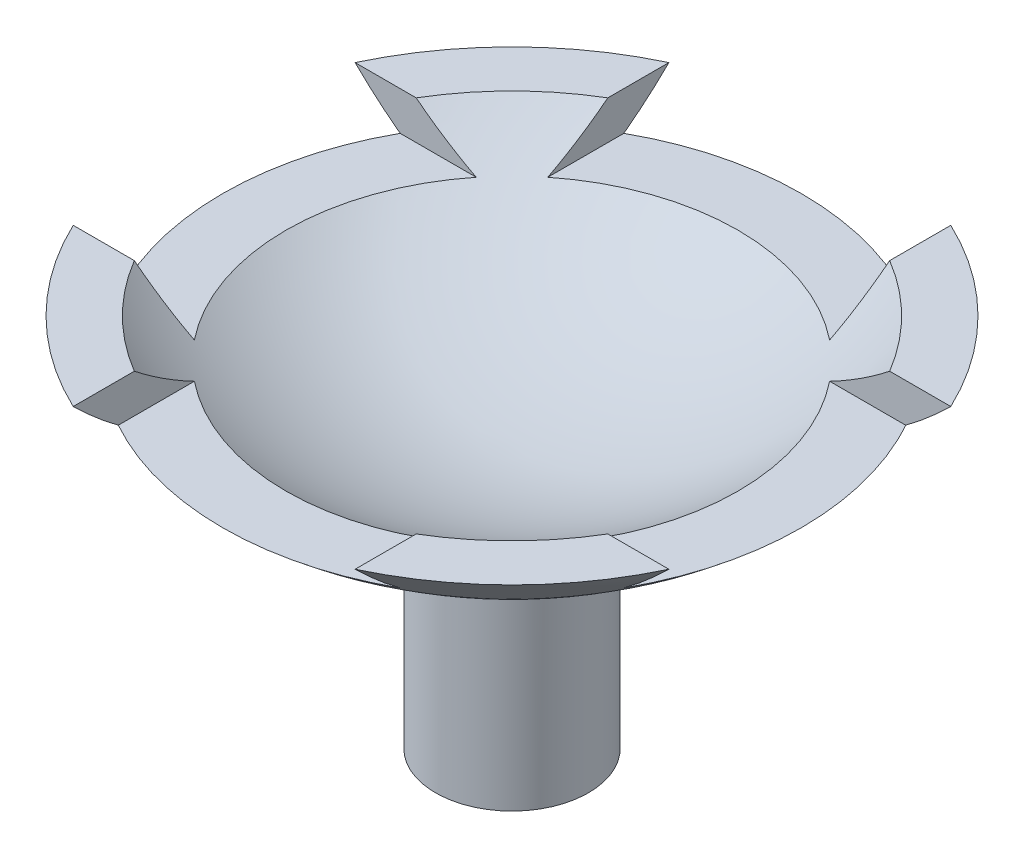
ISO-10303-21;
HEADER;
FILE_DESCRIPTION(('STEP AP214'),'2;1');
FILE_NAME('part.step','',(''),(''),'','','');
FILE_SCHEMA(('AUTOMOTIVE_DESIGN { 1 0 10303 214 1 1 1 1 }'));
ENDSEC;
DATA;
#1=APPLICATION_CONTEXT('core data for automotive mechanical design processes');
#2=APPLICATION_PROTOCOL_DEFINITION('international standard','automotive_design',2000,#1);
#3=PRODUCT_CONTEXT('',#1,'mechanical');
#4=PRODUCT('Part','Part','',(#3));
#5=PRODUCT_RELATED_PRODUCT_CATEGORY('part','',(#4));
#6=PRODUCT_DEFINITION_FORMATION('','',#4);
#7=PRODUCT_DEFINITION_CONTEXT('part definition',#1,'design');
#8=PRODUCT_DEFINITION('design','',#6,#7);
#9=PRODUCT_DEFINITION_SHAPE('','',#8);
#10=(LENGTH_UNIT() NAMED_UNIT(*) SI_UNIT(.MILLI.,.METRE.));
#11=(NAMED_UNIT(*) PLANE_ANGLE_UNIT() SI_UNIT($,.RADIAN.));
#12=(NAMED_UNIT(*) SI_UNIT($,.STERADIAN.) SOLID_ANGLE_UNIT());
#13=UNCERTAINTY_MEASURE_WITH_UNIT(LENGTH_MEASURE(1.E-05),#10,'distance_accuracy_value','');
#14=(GEOMETRIC_REPRESENTATION_CONTEXT(3) GLOBAL_UNCERTAINTY_ASSIGNED_CONTEXT((#13)) GLOBAL_UNIT_ASSIGNED_CONTEXT((#10,
#11,#12)) REPRESENTATION_CONTEXT('',''));
#15=CARTESIAN_POINT('',(0.,0.,0.));
#16=DIRECTION('',(0.,0.,1.));
#17=DIRECTION('',(1.,0.,0.));
#18=AXIS2_PLACEMENT_3D('',#15,#16,#17);
#19=CARTESIAN_POINT('',(0.,53.,0.));
#20=DIRECTION('',(0.,-1.,0.));
#21=DIRECTION('',(1.,0.,0.));
#22=AXIS2_PLACEMENT_3D('',#19,#20,#21);
#23=SPHERICAL_SURFACE('',#22,32.);
#24=CARTESIAN_POINT('',(0.,29.4,0.));
#25=DIRECTION('',(0.,-1.,0.));
#26=DIRECTION('',(0.,0.,-1.));
#27=AXIS2_PLACEMENT_3D('',#24,#25,#26);
#28=CIRCLE('',#27,21.6111082547841);
#29=CARTESIAN_POINT('',(-18.5695173604485,29.4,-11.0550000000001));
#30=VERTEX_POINT('',#29);
#31=CARTESIAN_POINT('',(-11.055,29.4,-18.5695173604485));
#32=VERTEX_POINT('',#31);
#33=EDGE_CURVE('E268',#30,#32,#28,.T.);
#34=ORIENTED_EDGE('',*,*,#33,.F.);
#35=CARTESIAN_POINT('',(0.,53.,-11.055));
#36=DIRECTION('',(0.,0.,1.));
#37=DIRECTION('',(1.,0.,0.));
#38=AXIS2_PLACEMENT_3D('',#35,#36,#37);
#39=CIRCLE('',#38,30.0297681476231);
#40=CARTESIAN_POINT('',(-13.8599197328122,26.36,-11.055));
#41=VERTEX_POINT('',#40);
#42=EDGE_CURVE('E224',#30,#41,#39,.T.);
#43=ORIENTED_EDGE('',*,*,#42,.T.);
#44=CARTESIAN_POINT('',(0.,26.36,0.));
#45=DIRECTION('',(0.,1.,0.));
#46=DIRECTION('',(0.,0.,1.));
#47=AXIS2_PLACEMENT_3D('',#44,#45,#46);
#48=CIRCLE('',#47,17.7288014259283);
#49=CARTESIAN_POINT('',(-13.8599197328123,26.36,11.0549999999999));
#50=VERTEX_POINT('',#49);
#51=EDGE_CURVE('E228',#41,#50,#48,.T.);
#52=ORIENTED_EDGE('',*,*,#51,.T.);
#53=CARTESIAN_POINT('',(0.,53.,11.055));
#54=DIRECTION('',(0.,0.,-1.));
#55=DIRECTION('',(-1.,0.,0.));
#56=AXIS2_PLACEMENT_3D('',#53,#54,#55);
#57=CIRCLE('',#56,30.0297681476231);
#58=CARTESIAN_POINT('',(-18.5695173604486,29.4,11.0549999999999));
#59=VERTEX_POINT('',#58);
#60=EDGE_CURVE('E215',#50,#59,#57,.T.);
#61=ORIENTED_EDGE('',*,*,#60,.T.);
#62=CARTESIAN_POINT('',(-11.055,29.4,18.5695173604485));
#63=VERTEX_POINT('',#62);
#64=EDGE_CURVE('E263',#63,#59,#28,.T.);
#65=ORIENTED_EDGE('',*,*,#64,.F.);
#66=CARTESIAN_POINT('',(-11.055,53.,0.));
#67=DIRECTION('',(1.,0.,0.));
#68=DIRECTION('',(0.,0.,-1.));
#69=AXIS2_PLACEMENT_3D('',#66,#67,#68);
#70=CIRCLE('',#69,30.0297681476231);
#71=CARTESIAN_POINT('',(-11.055,26.36,13.8599197328123));
#72=VERTEX_POINT('',#71);
#73=EDGE_CURVE('E254',#63,#72,#70,.T.);
#74=ORIENTED_EDGE('',*,*,#73,.T.);
#75=CARTESIAN_POINT('',(0.,26.36,0.));
#76=DIRECTION('',(0.,1.,0.));
#77=DIRECTION('',(0.,0.,1.));
#78=AXIS2_PLACEMENT_3D('',#75,#76,#77);
#79=CIRCLE('',#78,17.7288014259283);
#80=CARTESIAN_POINT('',(11.055,26.36,13.8599197328123));
#81=VERTEX_POINT('',#80);
#82=EDGE_CURVE('E258',#72,#81,#79,.T.);
#83=ORIENTED_EDGE('',*,*,#82,.T.);
#84=CARTESIAN_POINT('',(11.055,53.,0.));
#85=DIRECTION('',(-1.,0.,0.));
#86=DIRECTION('',(0.,0.,1.));
#87=AXIS2_PLACEMENT_3D('',#84,#85,#86);
#88=CIRCLE('',#87,30.0297681476231);
#89=CARTESIAN_POINT('',(11.055,29.4,18.5695173604485));
#90=VERTEX_POINT('',#89);
#91=EDGE_CURVE('E246',#81,#90,#88,.T.);
#92=ORIENTED_EDGE('',*,*,#91,.T.);
#93=CARTESIAN_POINT('',(18.5695173604485,29.4,11.0550000000001));
#94=VERTEX_POINT('',#93);
#95=EDGE_CURVE('E262',#94,#90,#28,.T.);
#96=ORIENTED_EDGE('',*,*,#95,.F.);
#97=CARTESIAN_POINT('',(13.8599197328122,26.36,11.055));
#98=VERTEX_POINT('',#97);
#99=EDGE_CURVE('E219',#94,#98,#57,.T.);
#100=ORIENTED_EDGE('',*,*,#99,.T.);
#101=CARTESIAN_POINT('',(13.8599197328124,26.36,-11.0549999999999));
#102=VERTEX_POINT('',#101);
#103=EDGE_CURVE('E233',#98,#102,#48,.T.);
#104=ORIENTED_EDGE('',*,*,#103,.T.);
#105=CARTESIAN_POINT('',(1.15794978602732E-13,53.,-11.055));
#106=DIRECTION('',(0.,0.,1.));
#107=DIRECTION('',(1.,0.,0.));
#108=AXIS2_PLACEMENT_3D('',#105,#106,#107);
#109=CIRCLE('',#108,30.0297681476231);
#110=CARTESIAN_POINT('',(18.5695173604486,29.4,-11.0549999999998));
#111=VERTEX_POINT('',#110);
#112=EDGE_CURVE('E177',#102,#111,#109,.T.);
#113=ORIENTED_EDGE('',*,*,#112,.T.);
#114=CARTESIAN_POINT('',(11.055,29.4,-18.5695173604485));
#115=VERTEX_POINT('',#114);
#116=EDGE_CURVE('E361',#115,#111,#28,.T.);
#117=ORIENTED_EDGE('',*,*,#116,.F.);
#118=CARTESIAN_POINT('',(11.055,53.,0.));
#119=DIRECTION('',(-1.,0.,0.));
#120=DIRECTION('',(0.,0.,1.));
#121=AXIS2_PLACEMENT_3D('',#118,#119,#120);
#122=CIRCLE('',#121,30.0297681476231);
#123=CARTESIAN_POINT('',(11.055,26.36,-13.8599197328123));
#124=VERTEX_POINT('',#123);
#125=EDGE_CURVE('E61',#115,#124,#122,.T.);
#126=ORIENTED_EDGE('',*,*,#125,.T.);
#127=CARTESIAN_POINT('',(-11.055,26.36,-13.8599197328123));
#128=VERTEX_POINT('',#127);
#129=EDGE_CURVE('E232',#124,#128,#48,.T.);
#130=ORIENTED_EDGE('',*,*,#129,.T.);
#131=CARTESIAN_POINT('',(-11.055,53.,0.));
#132=DIRECTION('',(1.,0.,0.));
#133=DIRECTION('',(0.,0.,-1.));
#134=AXIS2_PLACEMENT_3D('',#131,#132,#133);
#135=CIRCLE('',#134,30.0297681476231);
#136=EDGE_CURVE('E207',#128,#32,#135,.T.);
#137=ORIENTED_EDGE('',*,*,#136,.T.);
#138=EDGE_LOOP('',(#34,#43,#52,#61,#65,#74,#83,#92,#96,#100,#104,#113,#117,#126,#130,#137));
#139=FACE_BOUND('',#138,.T.);
#140=ADVANCED_FACE('F45',(#139),#23,.F.);
#141=CARTESIAN_POINT('',(0.,53.,0.));
#142=DIRECTION('',(0.,-1.,0.));
#143=DIRECTION('',(1.,0.,0.));
#144=AXIS2_PLACEMENT_3D('',#141,#142,#143);
#145=SPHERICAL_SURFACE('',#144,35.);
#146=CARTESIAN_POINT('',(0.,18.7468499461802,0.));
#147=DIRECTION('',(0.,1.,0.));
#148=DIRECTION('',(0.,0.,1.));
#149=AXIS2_PLACEMENT_3D('',#146,#147,#148);
#150=CIRCLE('',#149,7.19178082191781);
#151=CARTESIAN_POINT('',(0.,18.7468499461802,7.19178082191781));
#152=VERTEX_POINT('',#151);
#153=EDGE_CURVE('E11',#152,#152,#150,.T.);
#154=ORIENTED_EDGE('',*,*,#153,.T.);
#155=EDGE_LOOP('',(#154));
#156=FACE_BOUND('',#155,.T.);
#157=CARTESIAN_POINT('',(0.,26.36,0.));
#158=DIRECTION('',(0.,1.,0.));
#159=DIRECTION('',(0.,0.,1.));
#160=AXIS2_PLACEMENT_3D('',#157,#158,#159);
#161=CIRCLE('',#160,22.7004493347598);
#162=CARTESIAN_POINT('',(-19.8266834089819,26.36,11.0549999999999));
#163=VERTEX_POINT('',#162);
#164=CARTESIAN_POINT('',(-19.8266834089819,26.36,-11.0550000000001));
#165=VERTEX_POINT('',#164);
#166=EDGE_CURVE('E174',#163,#165,#161,.F.);
#167=ORIENTED_EDGE('',*,*,#166,.T.);
#168=CARTESIAN_POINT('',(0.,53.,-11.055));
#169=DIRECTION('',(0.,0.,1.));
#170=DIRECTION('',(1.,0.,0.));
#171=AXIS2_PLACEMENT_3D('',#168,#169,#170);
#172=CIRCLE('',#171,33.2082365536022);
#173=CARTESIAN_POINT('',(-23.3629402045204,29.4,-11.0550000000001));
#174=VERTEX_POINT('',#173);
#175=EDGE_CURVE('E220',#165,#174,#172,.F.);
#176=ORIENTED_EDGE('',*,*,#175,.T.);
#177=CARTESIAN_POINT('',(0.,29.4,0.));
#178=DIRECTION('',(0.,-1.,0.));
#179=DIRECTION('',(0.,0.,-1.));
#180=AXIS2_PLACEMENT_3D('',#177,#178,#179);
#181=CIRCLE('',#180,25.8464697782889);
#182=CARTESIAN_POINT('',(-11.055,29.4,-23.3629402045205));
#183=VERTEX_POINT('',#182);
#184=EDGE_CURVE('E274',#174,#183,#181,.T.);
#185=ORIENTED_EDGE('',*,*,#184,.T.);
#186=CARTESIAN_POINT('',(-11.055,53.,0.));
#187=DIRECTION('',(1.,0.,0.));
#188=DIRECTION('',(0.,0.,-1.));
#189=AXIS2_PLACEMENT_3D('',#186,#187,#188);
#190=CIRCLE('',#189,33.2082365536022);
#191=CARTESIAN_POINT('',(-11.055,26.36,-19.8266834089819));
#192=VERTEX_POINT('',#191);
#193=EDGE_CURVE('E203',#183,#192,#190,.F.);
#194=ORIENTED_EDGE('',*,*,#193,.T.);
#195=CARTESIAN_POINT('',(11.055,26.36,-19.8266834089819));
#196=VERTEX_POINT('',#195);
#197=EDGE_CURVE('E171',#192,#196,#161,.F.);
#198=ORIENTED_EDGE('',*,*,#197,.T.);
#199=CARTESIAN_POINT('',(11.055,53.,0.));
#200=DIRECTION('',(-1.,0.,0.));
#201=DIRECTION('',(0.,0.,1.));
#202=AXIS2_PLACEMENT_3D('',#199,#200,#201);
#203=CIRCLE('',#202,33.2082365536022);
#204=CARTESIAN_POINT('',(11.055,29.4,-23.3629402045205));
#205=VERTEX_POINT('',#204);
#206=EDGE_CURVE('E192',#196,#205,#203,.F.);
#207=ORIENTED_EDGE('',*,*,#206,.T.);
#208=CARTESIAN_POINT('',(23.3629402045206,29.4,-11.0549999999998));
#209=VERTEX_POINT('',#208);
#210=EDGE_CURVE('E186',#205,#209,#181,.T.);
#211=ORIENTED_EDGE('',*,*,#210,.T.);
#212=CARTESIAN_POINT('',(1.15794978602732E-13,53.,-11.055));
#213=DIRECTION('',(0.,0.,1.));
#214=DIRECTION('',(1.,0.,0.));
#215=AXIS2_PLACEMENT_3D('',#212,#213,#214);
#216=CIRCLE('',#215,33.2082365536022);
#217=CARTESIAN_POINT('',(19.826683408982,26.36,-11.0549999999998));
#218=VERTEX_POINT('',#217);
#219=EDGE_CURVE('E69',#209,#218,#216,.F.);
#220=ORIENTED_EDGE('',*,*,#219,.T.);
#221=CARTESIAN_POINT('',(19.8266834089819,26.36,11.0550000000001));
#222=VERTEX_POINT('',#221);
#223=EDGE_CURVE('E162',#218,#222,#161,.F.);
#224=ORIENTED_EDGE('',*,*,#223,.T.);
#225=CARTESIAN_POINT('',(0.,53.,11.055));
#226=DIRECTION('',(0.,0.,-1.));
#227=DIRECTION('',(-1.,0.,0.));
#228=AXIS2_PLACEMENT_3D('',#225,#226,#227);
#229=CIRCLE('',#228,33.2082365536022);
#230=CARTESIAN_POINT('',(23.3629402045204,29.4,11.0550000000001));
#231=VERTEX_POINT('',#230);
#232=EDGE_CURVE('E211',#222,#231,#229,.F.);
#233=ORIENTED_EDGE('',*,*,#232,.T.);
#234=CARTESIAN_POINT('',(11.055,29.4,23.3629402045205));
#235=VERTEX_POINT('',#234);
#236=EDGE_CURVE('E267',#231,#235,#181,.T.);
#237=ORIENTED_EDGE('',*,*,#236,.T.);
#238=CARTESIAN_POINT('',(11.055,53.,0.));
#239=DIRECTION('',(-1.,0.,0.));
#240=DIRECTION('',(0.,0.,1.));
#241=AXIS2_PLACEMENT_3D('',#238,#239,#240);
#242=CIRCLE('',#241,33.2082365536022);
#243=CARTESIAN_POINT('',(11.055,26.36,19.8266834089819));
#244=VERTEX_POINT('',#243);
#245=EDGE_CURVE('E242',#235,#244,#242,.F.);
#246=ORIENTED_EDGE('',*,*,#245,.T.);
#247=CARTESIAN_POINT('',(0.,26.36,0.));
#248=DIRECTION('',(0.,1.,0.));
#249=DIRECTION('',(0.,0.,1.));
#250=AXIS2_PLACEMENT_3D('',#247,#248,#249);
#251=CIRCLE('',#250,22.7004493347598);
#252=CARTESIAN_POINT('',(-11.055,26.36,19.8266834089819));
#253=VERTEX_POINT('',#252);
#254=EDGE_CURVE('E286',#244,#253,#251,.F.);
#255=ORIENTED_EDGE('',*,*,#254,.T.);
#256=CARTESIAN_POINT('',(-11.055,53.,0.));
#257=DIRECTION('',(1.,0.,0.));
#258=DIRECTION('',(0.,0.,-1.));
#259=AXIS2_PLACEMENT_3D('',#256,#257,#258);
#260=CIRCLE('',#259,33.2082365536022);
#261=CARTESIAN_POINT('',(-11.055,29.4,23.3629402045205));
#262=VERTEX_POINT('',#261);
#263=EDGE_CURVE('E250',#253,#262,#260,.F.);
#264=ORIENTED_EDGE('',*,*,#263,.T.);
#265=CARTESIAN_POINT('',(-23.3629402045205,29.4,11.0549999999999));
#266=VERTEX_POINT('',#265);
#267=EDGE_CURVE('E269',#262,#266,#181,.T.);
#268=ORIENTED_EDGE('',*,*,#267,.T.);
#269=EDGE_CURVE('E214',#266,#163,#229,.F.);
#270=ORIENTED_EDGE('',*,*,#269,.T.);
#271=EDGE_LOOP('',(#167,#176,#185,#194,#198,#207,#211,#220,#224,#233,#237,#246,#255,#264,#268,#270));
#272=FACE_BOUND('',#271,.T.);
#273=ADVANCED_FACE('F183',(#156,#272),#145,.T.);
#274=CARTESIAN_POINT('',(21.6111082547841,29.4,0.));
#275=DIRECTION('',(0.,1.,0.));
#276=DIRECTION('',(0.,0.,1.));
#277=AXIS2_PLACEMENT_3D('',#274,#275,#276);
#278=PLANE('',#277);
#279=ORIENTED_EDGE('',*,*,#184,.F.);
#280=DIRECTION('',(1.,0.,0.));
#281=VECTOR('',#280,1.);
#282=CARTESIAN_POINT('',(21.6111082547842,29.4,-11.0549999999999));
#283=LINE('',#282,#281);
#284=EDGE_CURVE('E172',#174,#30,#283,.T.);
#285=ORIENTED_EDGE('',*,*,#284,.T.);
#286=ORIENTED_EDGE('',*,*,#33,.T.);
#287=DIRECTION('',(0.,0.,-1.));
#288=VECTOR('',#287,1.);
#289=CARTESIAN_POINT('',(-11.055,29.4,0.));
#290=LINE('',#289,#288);
#291=EDGE_CURVE('E296',#32,#183,#290,.T.);
#292=ORIENTED_EDGE('',*,*,#291,.T.);
#293=EDGE_LOOP('',(#279,#285,#286,#292));
#294=FACE_BOUND('',#293,.T.);
#295=ADVANCED_FACE('F345',(#294),#278,.T.);
#296=ORIENTED_EDGE('',*,*,#236,.F.);
#297=DIRECTION('',(-1.,0.,0.));
#298=VECTOR('',#297,1.);
#299=CARTESIAN_POINT('',(21.6111082547841,29.4,11.0550000000001));
#300=LINE('',#299,#298);
#301=EDGE_CURVE('E304',#231,#94,#300,.T.);
#302=ORIENTED_EDGE('',*,*,#301,.T.);
#303=ORIENTED_EDGE('',*,*,#95,.T.);
#304=DIRECTION('',(0.,0.,1.));
#305=VECTOR('',#304,1.);
#306=CARTESIAN_POINT('',(11.055,29.4,0.));
#307=LINE('',#306,#305);
#308=EDGE_CURVE('E278',#90,#235,#307,.T.);
#309=ORIENTED_EDGE('',*,*,#308,.T.);
#310=EDGE_LOOP('',(#296,#302,#303,#309));
#311=FACE_BOUND('',#310,.T.);
#312=ADVANCED_FACE('F357',(#311),#278,.T.);
#313=ORIENTED_EDGE('',*,*,#64,.T.);
#314=EDGE_CURVE('E300',#59,#266,#300,.T.);
#315=ORIENTED_EDGE('',*,*,#314,.T.);
#316=ORIENTED_EDGE('',*,*,#267,.F.);
#317=DIRECTION('',(0.,0.,-1.));
#318=VECTOR('',#317,1.);
#319=CARTESIAN_POINT('',(-11.055,29.4,0.));
#320=LINE('',#319,#318);
#321=EDGE_CURVE('E282',#262,#63,#320,.T.);
#322=ORIENTED_EDGE('',*,*,#321,.T.);
#323=EDGE_LOOP('',(#313,#315,#316,#322));
#324=FACE_BOUND('',#323,.T.);
#325=ADVANCED_FACE('F427',(#324),#278,.T.);
#326=ORIENTED_EDGE('',*,*,#210,.F.);
#327=DIRECTION('',(0.,0.,1.));
#328=VECTOR('',#327,1.);
#329=CARTESIAN_POINT('',(11.055,29.4,0.));
#330=LINE('',#329,#328);
#331=EDGE_CURVE('E293',#205,#115,#330,.T.);
#332=ORIENTED_EDGE('',*,*,#331,.T.);
#333=ORIENTED_EDGE('',*,*,#116,.T.);
#334=DIRECTION('',(1.,0.,0.));
#335=VECTOR('',#334,1.);
#336=CARTESIAN_POINT('',(21.6111082547843,29.4,-11.0549999999998));
#337=LINE('',#336,#335);
#338=EDGE_CURVE('E290',#111,#209,#337,.T.);
#339=ORIENTED_EDGE('',*,*,#338,.T.);
#340=EDGE_LOOP('',(#326,#332,#333,#339));
#341=FACE_BOUND('',#340,.T.);
#342=ADVANCED_FACE('F367',(#341),#278,.T.);
#343=CARTESIAN_POINT('',(6.,0.,0.));
#344=DIRECTION('',(0.,-1.,0.));
#345=DIRECTION('',(0.,0.,-1.));
#346=AXIS2_PLACEMENT_3D('',#343,#344,#345);
#347=PLANE('',#346);
#348=CARTESIAN_POINT('',(0.,0.,0.));
#349=DIRECTION('',(0.,-1.,0.));
#350=DIRECTION('',(0.,0.,-1.));
#351=AXIS2_PLACEMENT_3D('',#348,#349,#350);
#352=CIRCLE('',#351,6.);
#353=CARTESIAN_POINT('',(0.,0.,-6.));
#354=VERTEX_POINT('',#353);
#355=EDGE_CURVE('E273',#354,#354,#352,.T.);
#356=ORIENTED_EDGE('',*,*,#355,.T.);
#357=EDGE_LOOP('',(#356));
#358=FACE_BOUND('',#357,.T.);
#359=ADVANCED_FACE('F389',(#358),#347,.T.);
#360=CARTESIAN_POINT('',(0.,0.,0.));
#361=DIRECTION('',(0.,-1.,0.));
#362=DIRECTION('',(0.,0.,-1.));
#363=AXIS2_PLACEMENT_3D('',#360,#361,#362);
#364=CYLINDRICAL_SURFACE('',#363,6.);
#365=CARTESIAN_POINT('',(0.,17.2788578010165,0.));
#366=DIRECTION('',(0.,1.,0.));
#367=DIRECTION('',(0.,0.,1.));
#368=AXIS2_PLACEMENT_3D('',#365,#366,#367);
#369=CIRCLE('',#368,6.);
#370=CARTESIAN_POINT('',(0.,17.2788578010165,6.));
#371=VERTEX_POINT('',#370);
#372=EDGE_CURVE('E54',#371,#371,#369,.F.);
#373=ORIENTED_EDGE('',*,*,#372,.T.);
#374=EDGE_LOOP('',(#373));
#375=FACE_BOUND('',#374,.T.);
#376=ORIENTED_EDGE('',*,*,#355,.F.);
#377=EDGE_LOOP('',(#376));
#378=FACE_BOUND('',#377,.T.);
#379=ADVANCED_FACE('F392',(#375,#378),#364,.T.);
#380=CARTESIAN_POINT('',(-11.055,29.4,25.8464697782889));
#381=DIRECTION('',(1.,0.,0.));
#382=DIRECTION('',(0.,0.,-1.));
#383=AXIS2_PLACEMENT_3D('',#380,#381,#382);
#384=PLANE('',#383);
#385=ORIENTED_EDGE('',*,*,#321,.F.);
#386=ORIENTED_EDGE('',*,*,#263,.F.);
#387=DIRECTION('',(0.,0.,-1.));
#388=VECTOR('',#387,1.);
#389=CARTESIAN_POINT('',(-11.055,26.36,25.8464697782889));
#390=LINE('',#389,#388);
#391=EDGE_CURVE('E238',#253,#72,#390,.T.);
#392=ORIENTED_EDGE('',*,*,#391,.T.);
#393=ORIENTED_EDGE('',*,*,#73,.F.);
#394=EDGE_LOOP('',(#385,#386,#392,#393));
#395=FACE_BOUND('',#394,.T.);
#396=ADVANCED_FACE('F395',(#395),#384,.T.);
#397=CARTESIAN_POINT('',(-11.055,26.36,25.8464697782889));
#398=DIRECTION('',(0.,1.,0.));
#399=DIRECTION('',(0.,0.,1.));
#400=AXIS2_PLACEMENT_3D('',#397,#398,#399);
#401=PLANE('',#400);
#402=ORIENTED_EDGE('',*,*,#391,.F.);
#403=ORIENTED_EDGE('',*,*,#254,.F.);
#404=DIRECTION('',(0.,0.,-1.));
#405=VECTOR('',#404,1.);
#406=CARTESIAN_POINT('',(11.055,26.36,25.8464697782889));
#407=LINE('',#406,#405);
#408=EDGE_CURVE('E234',#244,#81,#407,.T.);
#409=ORIENTED_EDGE('',*,*,#408,.T.);
#410=ORIENTED_EDGE('',*,*,#82,.F.);
#411=EDGE_LOOP('',(#402,#403,#409,#410));
#412=FACE_BOUND('',#411,.T.);
#413=ADVANCED_FACE('F400',(#412),#401,.T.);
#414=CARTESIAN_POINT('',(11.055,29.4,25.8464697782889));
#415=DIRECTION('',(-1.,0.,0.));
#416=DIRECTION('',(0.,0.,1.));
#417=AXIS2_PLACEMENT_3D('',#414,#415,#416);
#418=PLANE('',#417);
#419=ORIENTED_EDGE('',*,*,#408,.F.);
#420=ORIENTED_EDGE('',*,*,#245,.F.);
#421=ORIENTED_EDGE('',*,*,#308,.F.);
#422=ORIENTED_EDGE('',*,*,#91,.F.);
#423=EDGE_LOOP('',(#419,#420,#421,#422));
#424=FACE_BOUND('',#423,.T.);
#425=ADVANCED_FACE('F356',(#424),#418,.T.);
#426=CARTESIAN_POINT('',(25.8464697782892,29.4,-11.0549999999997));
#427=DIRECTION('',(0.,0.,1.));
#428=DIRECTION('',(1.,0.,0.));
#429=AXIS2_PLACEMENT_3D('',#426,#427,#428);
#430=PLANE('',#429);
#431=DIRECTION('',(-1.,0.,0.));
#432=VECTOR('',#431,1.);
#433=CARTESIAN_POINT('',(25.8464697782892,26.36,-11.0549999999997));
#434=LINE('',#433,#432);
#435=EDGE_CURVE('E164',#218,#102,#434,.T.);
#436=ORIENTED_EDGE('',*,*,#435,.F.);
#437=ORIENTED_EDGE('',*,*,#219,.F.);
#438=ORIENTED_EDGE('',*,*,#338,.F.);
#439=ORIENTED_EDGE('',*,*,#112,.F.);
#440=EDGE_LOOP('',(#436,#437,#438,#439));
#441=FACE_BOUND('',#440,.T.);
#442=ADVANCED_FACE('F175',(#441),#430,.T.);
#443=CARTESIAN_POINT('',(-25.846469778289,29.4,11.0549999999999));
#444=DIRECTION('',(0.,0.,-1.));
#445=DIRECTION('',(-1.,0.,0.));
#446=AXIS2_PLACEMENT_3D('',#443,#444,#445);
#447=PLANE('',#446);
#448=ORIENTED_EDGE('',*,*,#301,.F.);
#449=ORIENTED_EDGE('',*,*,#232,.F.);
#450=DIRECTION('',(1.,0.,0.));
#451=VECTOR('',#450,1.);
#452=CARTESIAN_POINT('',(-25.846469778289,26.36,11.0549999999999));
#453=LINE('',#452,#451);
#454=EDGE_CURVE('E167',#98,#222,#453,.T.);
#455=ORIENTED_EDGE('',*,*,#454,.F.);
#456=ORIENTED_EDGE('',*,*,#99,.F.);
#457=EDGE_LOOP('',(#448,#449,#455,#456));
#458=FACE_BOUND('',#457,.T.);
#459=ADVANCED_FACE('F410',(#458),#447,.T.);
#460=CARTESIAN_POINT('',(-25.8464697782889,26.36,-11.0550000000001));
#461=DIRECTION('',(0.,1.,0.));
#462=DIRECTION('',(0.,0.,1.));
#463=AXIS2_PLACEMENT_3D('',#460,#461,#462);
#464=PLANE('',#463);
#465=ORIENTED_EDGE('',*,*,#454,.T.);
#466=ORIENTED_EDGE('',*,*,#223,.F.);
#467=ORIENTED_EDGE('',*,*,#435,.T.);
#468=ORIENTED_EDGE('',*,*,#103,.F.);
#469=EDGE_LOOP('',(#465,#466,#467,#468));
#470=FACE_BOUND('',#469,.T.);
#471=ADVANCED_FACE('F163',(#470),#464,.T.);
#472=CARTESIAN_POINT('',(-11.055,29.4,-25.8464697782889));
#473=DIRECTION('',(1.,0.,0.));
#474=DIRECTION('',(0.,0.,-1.));
#475=AXIS2_PLACEMENT_3D('',#472,#473,#474);
#476=PLANE('',#475);
#477=DIRECTION('',(0.,0.,1.));
#478=VECTOR('',#477,1.);
#479=CARTESIAN_POINT('',(-11.055,26.36,-25.8464697782889));
#480=LINE('',#479,#478);
#481=EDGE_CURVE('E179',#192,#128,#480,.T.);
#482=ORIENTED_EDGE('',*,*,#481,.F.);
#483=ORIENTED_EDGE('',*,*,#193,.F.);
#484=ORIENTED_EDGE('',*,*,#291,.F.);
#485=ORIENTED_EDGE('',*,*,#136,.F.);
#486=EDGE_LOOP('',(#482,#483,#484,#485));
#487=FACE_BOUND('',#486,.T.);
#488=ADVANCED_FACE('F324',(#487),#476,.T.);
#489=CARTESIAN_POINT('',(11.055,29.4,-25.8464697782889));
#490=DIRECTION('',(-1.,0.,0.));
#491=DIRECTION('',(0.,0.,1.));
#492=AXIS2_PLACEMENT_3D('',#489,#490,#491);
#493=PLANE('',#492);
#494=ORIENTED_EDGE('',*,*,#331,.F.);
#495=ORIENTED_EDGE('',*,*,#206,.F.);
#496=DIRECTION('',(0.,0.,1.));
#497=VECTOR('',#496,1.);
#498=CARTESIAN_POINT('',(11.055,26.36,-25.8464697782889));
#499=LINE('',#498,#497);
#500=EDGE_CURVE('E322',#196,#124,#499,.T.);
#501=ORIENTED_EDGE('',*,*,#500,.T.);
#502=ORIENTED_EDGE('',*,*,#125,.F.);
#503=EDGE_LOOP('',(#494,#495,#501,#502));
#504=FACE_BOUND('',#503,.T.);
#505=ADVANCED_FACE('F370',(#504),#493,.T.);
#506=ORIENTED_EDGE('',*,*,#500,.F.);
#507=ORIENTED_EDGE('',*,*,#197,.F.);
#508=ORIENTED_EDGE('',*,*,#481,.T.);
#509=ORIENTED_EDGE('',*,*,#129,.F.);
#510=EDGE_LOOP('',(#506,#507,#508,#509));
#511=FACE_BOUND('',#510,.T.);
#512=ADVANCED_FACE('F320',(#511),#464,.T.);
#513=CARTESIAN_POINT('',(-25.8464697782889,29.4,-11.0550000000001));
#514=DIRECTION('',(0.,0.,1.));
#515=DIRECTION('',(1.,0.,0.));
#516=AXIS2_PLACEMENT_3D('',#513,#514,#515);
#517=PLANE('',#516);
#518=ORIENTED_EDGE('',*,*,#284,.F.);
#519=ORIENTED_EDGE('',*,*,#175,.F.);
#520=DIRECTION('',(1.,0.,0.));
#521=VECTOR('',#520,1.);
#522=CARTESIAN_POINT('',(-25.8464697782889,26.36,-11.0550000000001));
#523=LINE('',#522,#521);
#524=EDGE_CURVE('E188',#165,#41,#523,.T.);
#525=ORIENTED_EDGE('',*,*,#524,.T.);
#526=ORIENTED_EDGE('',*,*,#42,.F.);
#527=EDGE_LOOP('',(#518,#519,#525,#526));
#528=FACE_BOUND('',#527,.T.);
#529=ADVANCED_FACE('F342',(#528),#517,.T.);
#530=ORIENTED_EDGE('',*,*,#524,.F.);
#531=ORIENTED_EDGE('',*,*,#166,.F.);
#532=EDGE_CURVE('E195',#163,#50,#453,.T.);
#533=ORIENTED_EDGE('',*,*,#532,.T.);
#534=ORIENTED_EDGE('',*,*,#51,.F.);
#535=EDGE_LOOP('',(#530,#531,#533,#534));
#536=FACE_BOUND('',#535,.T.);
#537=ADVANCED_FACE('F335',(#536),#464,.T.);
#538=ORIENTED_EDGE('',*,*,#532,.F.);
#539=ORIENTED_EDGE('',*,*,#269,.F.);
#540=ORIENTED_EDGE('',*,*,#314,.F.);
#541=ORIENTED_EDGE('',*,*,#60,.F.);
#542=EDGE_LOOP('',(#538,#539,#540,#541));
#543=FACE_BOUND('',#542,.T.);
#544=ADVANCED_FACE('F408',(#543),#447,.T.);
#545=CARTESIAN_POINT('',(0.,17.2788578010165,0.));
#546=DIRECTION('',(0.,1.,0.));
#547=DIRECTION('',(0.,0.,1.));
#548=AXIS2_PLACEMENT_3D('',#545,#546,#547);
#549=TOROIDAL_SURFACE('',#548,7.5,1.5);
#550=ORIENTED_EDGE('',*,*,#153,.F.);
#551=EDGE_LOOP('',(#550));
#552=FACE_BOUND('',#551,.T.);
#553=ORIENTED_EDGE('',*,*,#372,.F.);
#554=EDGE_LOOP('',(#553));
#555=FACE_BOUND('',#554,.T.);
#556=ADVANCED_FACE('F47',(#552,#555),#549,.F.);
#557=CLOSED_SHELL('',(#140,#273,#295,#312,#325,#342,#359,#379,#396,#413,#425,#442,#459,#471,
#488,#505,#512,#529,#537,#544,#556));
#558=MANIFOLD_SOLID_BREP('B2',#557);
#559=ADVANCED_BREP_SHAPE_REPRESENTATION('',(#18,#558),#14);
#560=SHAPE_DEFINITION_REPRESENTATION(#9,#559);
ENDSEC;
END-ISO-10303-21;
